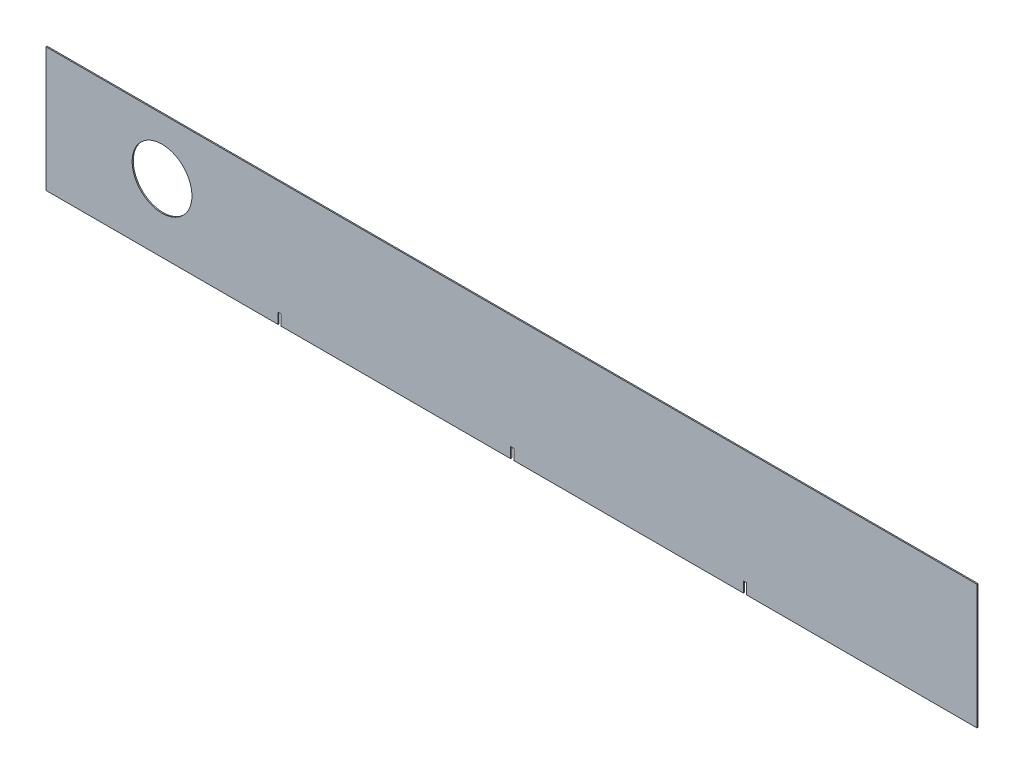
ISO-10303-21;
HEADER;
FILE_DESCRIPTION(('STEP AP214'),'2;1');
FILE_NAME('part.step','',(''),(''),'','','');
FILE_SCHEMA(('AUTOMOTIVE_DESIGN { 1 0 10303 214 1 1 1 1 }'));
ENDSEC;
DATA;
#1=APPLICATION_CONTEXT('core data for automotive mechanical design processes');
#2=APPLICATION_PROTOCOL_DEFINITION('international standard','automotive_design',2000,#1);
#3=PRODUCT_CONTEXT('',#1,'mechanical');
#4=PRODUCT('Part','Part','',(#3));
#5=PRODUCT_RELATED_PRODUCT_CATEGORY('part','',(#4));
#6=PRODUCT_DEFINITION_FORMATION('','',#4);
#7=PRODUCT_DEFINITION_CONTEXT('part definition',#1,'design');
#8=PRODUCT_DEFINITION('design','',#6,#7);
#9=PRODUCT_DEFINITION_SHAPE('','',#8);
#10=(LENGTH_UNIT() NAMED_UNIT(*) SI_UNIT(.MILLI.,.METRE.));
#11=(NAMED_UNIT(*) PLANE_ANGLE_UNIT() SI_UNIT($,.RADIAN.));
#12=(NAMED_UNIT(*) SI_UNIT($,.STERADIAN.) SOLID_ANGLE_UNIT());
#13=UNCERTAINTY_MEASURE_WITH_UNIT(LENGTH_MEASURE(1.E-05),#10,'distance_accuracy_value','');
#14=(GEOMETRIC_REPRESENTATION_CONTEXT(3) GLOBAL_UNCERTAINTY_ASSIGNED_CONTEXT((#13)) GLOBAL_UNIT_ASSIGNED_CONTEXT((#10,
#11,#12)) REPRESENTATION_CONTEXT('',''));
#15=CARTESIAN_POINT('',(0.,0.,0.));
#16=DIRECTION('',(0.,0.,1.));
#17=DIRECTION('',(1.,0.,0.));
#18=AXIS2_PLACEMENT_3D('',#15,#16,#17);
#19=CARTESIAN_POINT('',(0.,0.,0.));
#20=DIRECTION('',(0.,0.,-1.));
#21=DIRECTION('',(-1.,0.,0.));
#22=AXIS2_PLACEMENT_3D('',#19,#20,#21);
#23=PLANE('',#22);
#24=DIRECTION('',(0.,1.,0.));
#25=VECTOR('',#24,1.);
#26=CARTESIAN_POINT('',(1414.9984119364,-97.2312168042145,1.6903145549918E-11));
#27=LINE('',#26,#25);
#28=CARTESIAN_POINT('',(1414.9984119364,103.017676767677,1.69586567011493E-11));
#29=VERTEX_POINT('',#28);
#30=CARTESIAN_POINT('',(1414.9984119364,-115.480110376108,1.67366120962242E-11));
#31=VERTEX_POINT('',#30);
#32=EDGE_CURVE('E293',#29,#31,#27,.F.);
#33=ORIENTED_EDGE('',*,*,#32,.F.);
#34=DIRECTION('',(1.,0.,0.));
#35=VECTOR('',#34,1.);
#36=CARTESIAN_POINT('',(1007.50062479261,103.017676767677,8.49320613838245E-12));
#37=LINE('',#36,#35);
#38=CARTESIAN_POINT('',(-219.494949494949,103.017676767677,0.));
#39=VERTEX_POINT('',#38);
#40=EDGE_CURVE('E124',#39,#29,#37,.T.);
#41=ORIENTED_EDGE('',*,*,#40,.F.);
#42=DIRECTION('',(0.,-1.,0.));
#43=VECTOR('',#42,1.);
#44=CARTESIAN_POINT('',(-219.494949494949,-115.480110376105,-1.52655665885959E-13));
#45=LINE('',#44,#43);
#46=CARTESIAN_POINT('',(-219.494949494949,-115.480110376105,-1.52655665885959E-13));
#47=VERTEX_POINT('',#46);
#48=EDGE_CURVE('E231',#39,#47,#45,.T.);
#49=ORIENTED_EDGE('',*,*,#48,.T.);
#50=DIRECTION('',(1.,0.,0.));
#51=VECTOR('',#50,1.);
#52=CARTESIAN_POINT('',(188.005050505051,-115.480110376105,-1.38777878078145E-13));
#53=LINE('',#52,#51);
#54=CARTESIAN_POINT('',(188.005050505051,-115.480110376105,-1.38777878078145E-13));
#55=VERTEX_POINT('',#54);
#56=EDGE_CURVE('E245',#47,#55,#53,.T.);
#57=ORIENTED_EDGE('',*,*,#56,.T.);
#58=DIRECTION('',(0.,1.,0.));
#59=VECTOR('',#58,1.);
#60=CARTESIAN_POINT('',(188.005050505051,-97.4801103761054,0.));
#61=LINE('',#60,#59);
#62=CARTESIAN_POINT('',(188.005050505051,-96.9823232323232,0.));
#63=VERTEX_POINT('',#62);
#64=EDGE_CURVE('E243',#55,#63,#61,.T.);
#65=ORIENTED_EDGE('',*,*,#64,.T.);
#66=DIRECTION('',(-1.,0.,0.));
#67=VECTOR('',#66,1.);
#68=CARTESIAN_POINT('',(190.753944076942,-96.9823232323232,0.));
#69=LINE('',#68,#67);
#70=CARTESIAN_POINT('',(193.502837648833,-96.9823232323232,0.));
#71=VERTEX_POINT('',#70);
#72=EDGE_CURVE('E232',#71,#63,#69,.T.);
#73=ORIENTED_EDGE('',*,*,#72,.F.);
#74=DIRECTION('',(0.,-1.,0.));
#75=VECTOR('',#74,1.);
#76=CARTESIAN_POINT('',(193.502837648833,-115.480110376107,-8.88178419700125E-13));
#77=LINE('',#76,#75);
#78=CARTESIAN_POINT('',(193.502837648833,-115.480110376107,-8.88178419700125E-13));
#79=VERTEX_POINT('',#78);
#80=EDGE_CURVE('E272',#71,#79,#77,.T.);
#81=ORIENTED_EDGE('',*,*,#80,.T.);
#82=DIRECTION('',(1.,0.,0.));
#83=VECTOR('',#82,1.);
#84=CARTESIAN_POINT('',(596.502837648833,-115.480110376106,2.692290834716E-12));
#85=LINE('',#84,#83);
#86=CARTESIAN_POINT('',(596.502837648833,-115.480110376106,2.692290834716E-12));
#87=VERTEX_POINT('',#86);
#88=EDGE_CURVE('E269',#79,#87,#85,.T.);
#89=ORIENTED_EDGE('',*,*,#88,.T.);
#90=DIRECTION('',(0.,1.,0.));
#91=VECTOR('',#90,1.);
#92=CARTESIAN_POINT('',(596.502837648833,-97.4801103761062,2.80331313717852E-12));
#93=LINE('',#92,#91);
#94=CARTESIAN_POINT('',(596.502837648833,-96.9823232323233,2.80331313717852E-12));
#95=VERTEX_POINT('',#94);
#96=EDGE_CURVE('E267',#87,#95,#93,.T.);
#97=ORIENTED_EDGE('',*,*,#96,.T.);
#98=DIRECTION('',(-1.,0.,0.));
#99=VECTOR('',#98,1.);
#100=CARTESIAN_POINT('',(599.251731220724,-96.9823232323233,2.85882428840978E-12));
#101=LINE('',#100,#99);
#102=CARTESIAN_POINT('',(602.000624792615,-96.9823232323233,2.85882428840978E-12));
#103=VERTEX_POINT('',#102);
#104=EDGE_CURVE('E264',#103,#95,#101,.T.);
#105=ORIENTED_EDGE('',*,*,#104,.F.);
#106=DIRECTION('',(0.,1.,0.));
#107=VECTOR('',#106,1.);
#108=CARTESIAN_POINT('',(602.000624792615,-97.2312168042145,2.85882428840978E-12));
#109=LINE('',#108,#107);
#110=CARTESIAN_POINT('',(602.000624792615,-115.480110376104,5.63438184997267E-12));
#111=VERTEX_POINT('',#110);
#112=EDGE_CURVE('E323',#111,#103,#109,.T.);
#113=ORIENTED_EDGE('',*,*,#112,.F.);
#114=DIRECTION('',(1.,0.,0.));
#115=VECTOR('',#114,1.);
#116=CARTESIAN_POINT('',(1005.00062479261,-115.480110376107,8.38218383591993E-12));
#117=LINE('',#116,#115);
#118=CARTESIAN_POINT('',(1005.00062479261,-115.480110376107,8.38218383591993E-12));
#119=VERTEX_POINT('',#118);
#120=EDGE_CURVE('E314',#111,#119,#117,.T.);
#121=ORIENTED_EDGE('',*,*,#120,.T.);
#122=DIRECTION('',(0.,1.,0.));
#123=VECTOR('',#122,1.);
#124=CARTESIAN_POINT('',(1005.00062479261,-97.2312168042145,8.49320613838245E-12));
#125=LINE('',#124,#123);
#126=CARTESIAN_POINT('',(1005.00062479261,-96.9823232323234,8.49320613838245E-12));
#127=VERTEX_POINT('',#126);
#128=EDGE_CURVE('E111',#127,#119,#125,.F.);
#129=ORIENTED_EDGE('',*,*,#128,.F.);
#130=DIRECTION('',(-1.,0.,0.));
#131=VECTOR('',#130,1.);
#132=CARTESIAN_POINT('',(1007.74951836451,-96.9823232323234,8.54871728961371E-12));
#133=LINE('',#132,#131);
#134=CARTESIAN_POINT('',(1010.4984119364,-96.9823232323235,8.43769498715119E-12));
#135=VERTEX_POINT('',#134);
#136=EDGE_CURVE('E87',#135,#127,#133,.T.);
#137=ORIENTED_EDGE('',*,*,#136,.F.);
#138=DIRECTION('',(0.,-1.,0.));
#139=VECTOR('',#138,1.);
#140=CARTESIAN_POINT('',(1010.4984119364,-115.480110376108,8.04911692853238E-12));
#141=LINE('',#140,#139);
#142=CARTESIAN_POINT('',(1010.4984119364,-115.480110376108,8.04911692853238E-12));
#143=VERTEX_POINT('',#142);
#144=EDGE_CURVE('E291',#135,#143,#141,.T.);
#145=ORIENTED_EDGE('',*,*,#144,.T.);
#146=DIRECTION('',(1.,0.,0.));
#147=VECTOR('',#146,1.);
#148=CARTESIAN_POINT('',(1414.9984119364,-115.480110376108,1.67366120962242E-11));
#149=LINE('',#148,#147);
#150=EDGE_CURVE('E288',#143,#31,#149,.T.);
#151=ORIENTED_EDGE('',*,*,#150,.T.);
#152=EDGE_LOOP('',(#33,#41,#49,#57,#65,#73,#81,#89,#97,#105,#113,#121,#129,#137,#145,#151));
#153=FACE_BOUND('',#152,.T.);
#154=CARTESIAN_POINT('',(-15.7449494949495,4.26767676767675,0.));
#155=DIRECTION('',(0.,0.,1.));
#156=DIRECTION('',(1.,0.,0.));
#157=AXIS2_PLACEMENT_3D('',#154,#155,#156);
#158=CIRCLE('',#157,52.5);
#159=CARTESIAN_POINT('',(36.7550505050505,4.26767676767675,0.));
#160=VERTEX_POINT('',#159);
#161=EDGE_CURVE('E249',#160,#160,#158,.T.);
#162=ORIENTED_EDGE('',*,*,#161,.F.);
#163=EDGE_LOOP('',(#162));
#164=FACE_BOUND('',#163,.T.);
#165=ADVANCED_FACE('F73',(#153,#164),#23,.F.);
#166=CARTESIAN_POINT('',(790.005675297664,0.,-1.99999999999453));
#167=DIRECTION('',(0.,0.,1.));
#168=DIRECTION('',(1.,0.,0.));
#169=AXIS2_PLACEMENT_3D('',#166,#167,#168);
#170=PLANE('',#169);
#171=DIRECTION('',(-1.,0.,0.));
#172=VECTOR('',#171,1.);
#173=CARTESIAN_POINT('',(1007.74951836451,-96.9823232323234,-1.99999999999145));
#174=LINE('',#173,#172);
#175=CARTESIAN_POINT('',(1010.4984119364,-96.9823232323235,-1.99999999999151));
#176=VERTEX_POINT('',#175);
#177=CARTESIAN_POINT('',(1005.00062479261,-96.9823232323234,-1.99999999999145));
#178=VERTEX_POINT('',#177);
#179=EDGE_CURVE('E308',#176,#178,#174,.T.);
#180=ORIENTED_EDGE('',*,*,#179,.T.);
#181=DIRECTION('',(0.,1.,0.));
#182=VECTOR('',#181,1.);
#183=CARTESIAN_POINT('',(1005.00062479261,-97.2312168042145,-1.99999999999151));
#184=LINE('',#183,#182);
#185=CARTESIAN_POINT('',(1005.00062479261,-115.480110376107,-1.99999999999162));
#186=VERTEX_POINT('',#185);
#187=EDGE_CURVE('E321',#178,#186,#184,.F.);
#188=ORIENTED_EDGE('',*,*,#187,.T.);
#189=DIRECTION('',(1.,0.,0.));
#190=VECTOR('',#189,1.);
#191=CARTESIAN_POINT('',(1005.00062479261,-115.480110376107,-1.99999999999162));
#192=LINE('',#191,#190);
#193=CARTESIAN_POINT('',(602.000624792615,-115.480110376104,-1.99999999999437));
#194=VERTEX_POINT('',#193);
#195=EDGE_CURVE('E310',#194,#186,#192,.T.);
#196=ORIENTED_EDGE('',*,*,#195,.F.);
#197=DIRECTION('',(0.,1.,0.));
#198=VECTOR('',#197,1.);
#199=CARTESIAN_POINT('',(602.000624792615,-97.2312168042145,-1.99999999999714));
#200=LINE('',#199,#198);
#201=CARTESIAN_POINT('',(602.000624792615,-96.9823232323233,-1.99999999999714));
#202=VERTEX_POINT('',#201);
#203=EDGE_CURVE('E96',#194,#202,#200,.T.);
#204=ORIENTED_EDGE('',*,*,#203,.T.);
#205=DIRECTION('',(-1.,0.,0.));
#206=VECTOR('',#205,1.);
#207=CARTESIAN_POINT('',(599.251731220724,-96.9823232323233,-1.99999999999714));
#208=LINE('',#207,#206);
#209=CARTESIAN_POINT('',(596.502837648833,-96.9823232323233,-1.99999999999717));
#210=VERTEX_POINT('',#209);
#211=EDGE_CURVE('E159',#202,#210,#208,.T.);
#212=ORIENTED_EDGE('',*,*,#211,.T.);
#213=DIRECTION('',(0.,1.,0.));
#214=VECTOR('',#213,1.);
#215=CARTESIAN_POINT('',(596.502837648833,-97.4801103761062,-1.9999999999972));
#216=LINE('',#215,#214);
#217=CARTESIAN_POINT('',(596.502837648833,-115.480110376106,-1.99999999999731));
#218=VERTEX_POINT('',#217);
#219=EDGE_CURVE('E265',#218,#210,#216,.T.);
#220=ORIENTED_EDGE('',*,*,#219,.F.);
#221=DIRECTION('',(1.,0.,0.));
#222=VECTOR('',#221,1.);
#223=CARTESIAN_POINT('',(596.502837648833,-115.480110376106,-1.99999999999731));
#224=LINE('',#223,#222);
#225=CARTESIAN_POINT('',(193.502837648833,-115.480110376107,-2.00000000000089));
#226=VERTEX_POINT('',#225);
#227=EDGE_CURVE('E259',#226,#218,#224,.T.);
#228=ORIENTED_EDGE('',*,*,#227,.F.);
#229=DIRECTION('',(0.,-1.,0.));
#230=VECTOR('',#229,1.);
#231=CARTESIAN_POINT('',(193.502837648833,-115.480110376107,-2.00000000000089));
#232=LINE('',#231,#230);
#233=CARTESIAN_POINT('',(193.502837648833,-96.9823232323232,-2.00000000000004));
#234=VERTEX_POINT('',#233);
#235=EDGE_CURVE('E277',#234,#226,#232,.T.);
#236=ORIENTED_EDGE('',*,*,#235,.F.);
#237=DIRECTION('',(-1.,0.,0.));
#238=VECTOR('',#237,1.);
#239=CARTESIAN_POINT('',(190.753944076942,-96.9823232323232,-2.00000000000004));
#240=LINE('',#239,#238);
#241=CARTESIAN_POINT('',(188.005050505051,-96.9823232323232,-2.00000000000004));
#242=VERTEX_POINT('',#241);
#243=EDGE_CURVE('E236',#234,#242,#240,.T.);
#244=ORIENTED_EDGE('',*,*,#243,.T.);
#245=DIRECTION('',(0.,1.,0.));
#246=VECTOR('',#245,1.);
#247=CARTESIAN_POINT('',(188.005050505051,-97.4801103761054,-2.00000000000002));
#248=LINE('',#247,#246);
#249=CARTESIAN_POINT('',(188.005050505051,-115.480110376105,-2.00000000000014));
#250=VERTEX_POINT('',#249);
#251=EDGE_CURVE('E239',#250,#242,#248,.T.);
#252=ORIENTED_EDGE('',*,*,#251,.F.);
#253=DIRECTION('',(1.,0.,0.));
#254=VECTOR('',#253,1.);
#255=CARTESIAN_POINT('',(188.005050505051,-115.480110376105,-2.00000000000014));
#256=LINE('',#255,#254);
#257=CARTESIAN_POINT('',(-219.494949494949,-115.480110376105,-2.00000000000015));
#258=VERTEX_POINT('',#257);
#259=EDGE_CURVE('E222',#258,#250,#256,.T.);
#260=ORIENTED_EDGE('',*,*,#259,.F.);
#261=DIRECTION('',(0.,-1.,0.));
#262=VECTOR('',#261,1.);
#263=CARTESIAN_POINT('',(-219.494949494949,-115.480110376105,-2.00000000000015));
#264=LINE('',#263,#262);
#265=CARTESIAN_POINT('',(-219.494949494949,103.017676767677,-2.));
#266=VERTEX_POINT('',#265);
#267=EDGE_CURVE('E217',#266,#258,#264,.T.);
#268=ORIENTED_EDGE('',*,*,#267,.F.);
#269=DIRECTION('',(1.,0.,0.));
#270=VECTOR('',#269,1.);
#271=CARTESIAN_POINT('',(1007.50062479261,103.017676767677,-1.99999999999151));
#272=LINE('',#271,#270);
#273=CARTESIAN_POINT('',(1414.9984119364,103.017676767677,-1.99999999998304));
#274=VERTEX_POINT('',#273);
#275=EDGE_CURVE('E207',#266,#274,#272,.T.);
#276=ORIENTED_EDGE('',*,*,#275,.T.);
#277=DIRECTION('',(0.,1.,0.));
#278=VECTOR('',#277,1.);
#279=CARTESIAN_POINT('',(1414.9984119364,-97.4801103761077,-1.9999999999831));
#280=LINE('',#279,#278);
#281=CARTESIAN_POINT('',(1414.9984119364,-115.480110376108,-1.99999999998327));
#282=VERTEX_POINT('',#281);
#283=EDGE_CURVE('E305',#282,#274,#280,.T.);
#284=ORIENTED_EDGE('',*,*,#283,.F.);
#285=DIRECTION('',(1.,0.,0.));
#286=VECTOR('',#285,1.);
#287=CARTESIAN_POINT('',(1414.9984119364,-115.480110376108,-1.99999999998327));
#288=LINE('',#287,#286);
#289=CARTESIAN_POINT('',(1010.4984119364,-115.480110376108,-1.99999999999195));
#290=VERTEX_POINT('',#289);
#291=EDGE_CURVE('E302',#290,#282,#288,.T.);
#292=ORIENTED_EDGE('',*,*,#291,.F.);
#293=DIRECTION('',(0.,-1.,0.));
#294=VECTOR('',#293,1.);
#295=CARTESIAN_POINT('',(1010.4984119364,-115.480110376108,-1.99999999999195));
#296=LINE('',#295,#294);
#297=EDGE_CURVE('E151',#176,#290,#296,.T.);
#298=ORIENTED_EDGE('',*,*,#297,.F.);
#299=EDGE_LOOP('',(#180,#188,#196,#204,#212,#220,#228,#236,#244,#252,#260,#268,#276,#284,#292,#298));
#300=FACE_BOUND('',#299,.T.);
#301=CARTESIAN_POINT('',(-15.7449494949495,4.26767676767675,-2.));
#302=DIRECTION('',(0.,0.,-1.));
#303=DIRECTION('',(-1.,0.,0.));
#304=AXIS2_PLACEMENT_3D('',#301,#302,#303);
#305=CIRCLE('',#304,52.5);
#306=CARTESIAN_POINT('',(-68.2449494949494,4.26767676767675,-2.));
#307=VERTEX_POINT('',#306);
#308=EDGE_CURVE('E252',#307,#307,#305,.T.);
#309=ORIENTED_EDGE('',*,*,#308,.F.);
#310=EDGE_LOOP('',(#309));
#311=FACE_BOUND('',#310,.T.);
#312=ADVANCED_FACE('F218',(#300,#311),#170,.F.);
#313=CARTESIAN_POINT('',(1007.50062479261,103.017676767677,8.49320613838245E-12));
#314=DIRECTION('',(0.,1.,0.));
#315=DIRECTION('',(1.,0.,0.));
#316=AXIS2_PLACEMENT_3D('',#313,#314,#315);
#317=PLANE('',#316);
#318=ORIENTED_EDGE('',*,*,#40,.T.);
#319=DIRECTION('',(0.,0.,-1.));
#320=VECTOR('',#319,1.);
#321=CARTESIAN_POINT('',(1414.9984119364,103.017676767677,1.69586567011493E-11));
#322=LINE('',#321,#320);
#323=EDGE_CURVE('E213',#29,#274,#322,.T.);
#324=ORIENTED_EDGE('',*,*,#323,.T.);
#325=ORIENTED_EDGE('',*,*,#275,.F.);
#326=DIRECTION('',(0.,0.,1.));
#327=VECTOR('',#326,1.);
#328=CARTESIAN_POINT('',(-219.494949494949,103.017676767677,-2.));
#329=LINE('',#328,#327);
#330=EDGE_CURVE('E211',#266,#39,#329,.T.);
#331=ORIENTED_EDGE('',*,*,#330,.T.);
#332=EDGE_LOOP('',(#318,#324,#325,#331));
#333=FACE_BOUND('',#332,.T.);
#334=ADVANCED_FACE('F209',(#333),#317,.T.);
#335=CARTESIAN_POINT('',(602.000624792615,-97.2312168042145,-0.999999999997142));
#336=DIRECTION('',(-1.,0.,0.));
#337=DIRECTION('',(0.,1.,0.));
#338=AXIS2_PLACEMENT_3D('',#335,#336,#337);
#339=PLANE('',#338);
#340=DIRECTION('',(0.,0.,1.));
#341=VECTOR('',#340,1.);
#342=CARTESIAN_POINT('',(602.000624792615,-96.9823232323233,-1.99999999999725));
#343=LINE('',#342,#341);
#344=EDGE_CURVE('E80',#202,#103,#343,.T.);
#345=ORIENTED_EDGE('',*,*,#344,.F.);
#346=ORIENTED_EDGE('',*,*,#203,.F.);
#347=DIRECTION('',(0.,0.,1.));
#348=VECTOR('',#347,1.);
#349=CARTESIAN_POINT('',(602.000624792615,-115.480110376104,-1.99999999999437));
#350=LINE('',#349,#348);
#351=EDGE_CURVE('E312',#194,#111,#350,.T.);
#352=ORIENTED_EDGE('',*,*,#351,.T.);
#353=ORIENTED_EDGE('',*,*,#112,.T.);
#354=EDGE_LOOP('',(#345,#346,#352,#353));
#355=FACE_BOUND('',#354,.T.);
#356=ADVANCED_FACE('F334',(#355),#339,.T.);
#357=CARTESIAN_POINT('',(1005.00062479261,-97.2312168042145,-0.999999999991508));
#358=DIRECTION('',(-1.,0.,0.));
#359=DIRECTION('',(0.,1.,0.));
#360=AXIS2_PLACEMENT_3D('',#357,#358,#359);
#361=PLANE('',#360);
#362=ORIENTED_EDGE('',*,*,#187,.F.);
#363=DIRECTION('',(0.,0.,1.));
#364=VECTOR('',#363,1.);
#365=CARTESIAN_POINT('',(1005.00062479261,-96.9823232323234,-1.99999999999145));
#366=LINE('',#365,#364);
#367=EDGE_CURVE('E115',#178,#127,#366,.T.);
#368=ORIENTED_EDGE('',*,*,#367,.T.);
#369=ORIENTED_EDGE('',*,*,#128,.T.);
#370=DIRECTION('',(0.,0.,1.));
#371=VECTOR('',#370,1.);
#372=CARTESIAN_POINT('',(1005.00062479261,-115.480110376107,-1.99999999999162));
#373=LINE('',#372,#371);
#374=EDGE_CURVE('E317',#186,#119,#373,.T.);
#375=ORIENTED_EDGE('',*,*,#374,.F.);
#376=EDGE_LOOP('',(#362,#368,#369,#375));
#377=FACE_BOUND('',#376,.T.);
#378=ADVANCED_FACE('F340',(#377),#361,.F.);
#379=CARTESIAN_POINT('',(1005.00062479261,-115.480110376107,-1.99999999999162));
#380=DIRECTION('',(0.,-1.,0.));
#381=DIRECTION('',(1.,0.,0.));
#382=AXIS2_PLACEMENT_3D('',#379,#380,#381);
#383=PLANE('',#382);
#384=ORIENTED_EDGE('',*,*,#120,.F.);
#385=ORIENTED_EDGE('',*,*,#351,.F.);
#386=ORIENTED_EDGE('',*,*,#195,.T.);
#387=ORIENTED_EDGE('',*,*,#374,.T.);
#388=EDGE_LOOP('',(#384,#385,#386,#387));
#389=FACE_BOUND('',#388,.T.);
#390=ADVANCED_FACE('F338',(#389),#383,.T.);
#391=CARTESIAN_POINT('',(1007.74951836451,-96.9823232323234,-0.999999999991452));
#392=DIRECTION('',(0.,-1.,0.));
#393=DIRECTION('',(-1.,0.,0.));
#394=AXIS2_PLACEMENT_3D('',#391,#392,#393);
#395=PLANE('',#394);
#396=ORIENTED_EDGE('',*,*,#136,.T.);
#397=ORIENTED_EDGE('',*,*,#367,.F.);
#398=ORIENTED_EDGE('',*,*,#179,.F.);
#399=DIRECTION('',(0.,0.,1.));
#400=VECTOR('',#399,1.);
#401=CARTESIAN_POINT('',(1010.4984119364,-96.9823232323235,-1.99999999999162));
#402=LINE('',#401,#400);
#403=EDGE_CURVE('E284',#176,#135,#402,.T.);
#404=ORIENTED_EDGE('',*,*,#403,.T.);
#405=EDGE_LOOP('',(#396,#397,#398,#404));
#406=FACE_BOUND('',#405,.T.);
#407=ADVANCED_FACE('F341',(#406),#395,.T.);
#408=CARTESIAN_POINT('',(1414.9984119364,-97.4801103761077,-1.9999999999831));
#409=DIRECTION('',(1.,0.,0.));
#410=DIRECTION('',(0.,1.,0.));
#411=AXIS2_PLACEMENT_3D('',#408,#409,#410);
#412=PLANE('',#411);
#413=ORIENTED_EDGE('',*,*,#283,.T.);
#414=ORIENTED_EDGE('',*,*,#323,.F.);
#415=ORIENTED_EDGE('',*,*,#32,.T.);
#416=DIRECTION('',(0.,0.,1.));
#417=VECTOR('',#416,1.);
#418=CARTESIAN_POINT('',(1414.9984119364,-115.480110376108,-1.99999999998327));
#419=LINE('',#418,#417);
#420=EDGE_CURVE('E299',#282,#31,#419,.T.);
#421=ORIENTED_EDGE('',*,*,#420,.F.);
#422=EDGE_LOOP('',(#413,#414,#415,#421));
#423=FACE_BOUND('',#422,.T.);
#424=ADVANCED_FACE('F349',(#423),#412,.T.);
#425=CARTESIAN_POINT('',(1414.9984119364,-115.480110376108,-1.99999999998327));
#426=DIRECTION('',(0.,-1.,0.));
#427=DIRECTION('',(1.,0.,0.));
#428=AXIS2_PLACEMENT_3D('',#425,#426,#427);
#429=PLANE('',#428);
#430=ORIENTED_EDGE('',*,*,#150,.F.);
#431=DIRECTION('',(0.,0.,1.));
#432=VECTOR('',#431,1.);
#433=CARTESIAN_POINT('',(1010.4984119364,-115.480110376108,-1.99999999999195));
#434=LINE('',#433,#432);
#435=EDGE_CURVE('E295',#290,#143,#434,.T.);
#436=ORIENTED_EDGE('',*,*,#435,.F.);
#437=ORIENTED_EDGE('',*,*,#291,.T.);
#438=ORIENTED_EDGE('',*,*,#420,.T.);
#439=EDGE_LOOP('',(#430,#436,#437,#438));
#440=FACE_BOUND('',#439,.T.);
#441=ADVANCED_FACE('F347',(#440),#429,.T.);
#442=CARTESIAN_POINT('',(1010.4984119364,-115.480110376108,-1.99999999999195));
#443=DIRECTION('',(-1.,0.,0.));
#444=DIRECTION('',(0.,-1.,0.));
#445=AXIS2_PLACEMENT_3D('',#442,#443,#444);
#446=PLANE('',#445);
#447=ORIENTED_EDGE('',*,*,#144,.F.);
#448=ORIENTED_EDGE('',*,*,#403,.F.);
#449=ORIENTED_EDGE('',*,*,#297,.T.);
#450=ORIENTED_EDGE('',*,*,#435,.T.);
#451=EDGE_LOOP('',(#447,#448,#449,#450));
#452=FACE_BOUND('',#451,.T.);
#453=ADVANCED_FACE('F343',(#452),#446,.T.);
#454=CARTESIAN_POINT('',(599.251731220724,-96.9823232323233,-0.999999999997142));
#455=DIRECTION('',(0.,-1.,0.));
#456=DIRECTION('',(-1.,0.,0.));
#457=AXIS2_PLACEMENT_3D('',#454,#455,#456);
#458=PLANE('',#457);
#459=ORIENTED_EDGE('',*,*,#104,.T.);
#460=DIRECTION('',(0.,0.,1.));
#461=VECTOR('',#460,1.);
#462=CARTESIAN_POINT('',(596.502837648833,-96.9823232323233,-1.9999999999972));
#463=LINE('',#462,#461);
#464=EDGE_CURVE('E261',#210,#95,#463,.T.);
#465=ORIENTED_EDGE('',*,*,#464,.F.);
#466=ORIENTED_EDGE('',*,*,#211,.F.);
#467=ORIENTED_EDGE('',*,*,#344,.T.);
#468=EDGE_LOOP('',(#459,#465,#466,#467));
#469=FACE_BOUND('',#468,.T.);
#470=ADVANCED_FACE('F330',(#469),#458,.T.);
#471=CARTESIAN_POINT('',(596.502837648833,-115.480110376106,-1.99999999999731));
#472=DIRECTION('',(0.,-1.,0.));
#473=DIRECTION('',(1.,0.,0.));
#474=AXIS2_PLACEMENT_3D('',#471,#472,#473);
#475=PLANE('',#474);
#476=ORIENTED_EDGE('',*,*,#88,.F.);
#477=DIRECTION('',(0.,0.,1.));
#478=VECTOR('',#477,1.);
#479=CARTESIAN_POINT('',(193.502837648833,-115.480110376107,-2.00000000000089));
#480=LINE('',#479,#478);
#481=EDGE_CURVE('E274',#226,#79,#480,.T.);
#482=ORIENTED_EDGE('',*,*,#481,.F.);
#483=ORIENTED_EDGE('',*,*,#227,.T.);
#484=DIRECTION('',(0.,0.,1.));
#485=VECTOR('',#484,1.);
#486=CARTESIAN_POINT('',(596.502837648833,-115.480110376106,-1.99999999999731));
#487=LINE('',#486,#485);
#488=EDGE_CURVE('E279',#218,#87,#487,.T.);
#489=ORIENTED_EDGE('',*,*,#488,.T.);
#490=EDGE_LOOP('',(#476,#482,#483,#489));
#491=FACE_BOUND('',#490,.T.);
#492=ADVANCED_FACE('F378',(#491),#475,.T.);
#493=CARTESIAN_POINT('',(193.502837648833,-115.480110376107,-2.00000000000089));
#494=DIRECTION('',(-1.,0.,0.));
#495=DIRECTION('',(0.,-1.,0.));
#496=AXIS2_PLACEMENT_3D('',#493,#494,#495);
#497=PLANE('',#496);
#498=ORIENTED_EDGE('',*,*,#80,.F.);
#499=DIRECTION('',(0.,0.,1.));
#500=VECTOR('',#499,1.);
#501=CARTESIAN_POINT('',(193.502837648833,-96.9823232323232,-1.99999999999997));
#502=LINE('',#501,#500);
#503=EDGE_CURVE('E12',#234,#71,#502,.T.);
#504=ORIENTED_EDGE('',*,*,#503,.F.);
#505=ORIENTED_EDGE('',*,*,#235,.T.);
#506=ORIENTED_EDGE('',*,*,#481,.T.);
#507=EDGE_LOOP('',(#498,#504,#505,#506));
#508=FACE_BOUND('',#507,.T.);
#509=ADVANCED_FACE('F382',(#508),#497,.T.);
#510=CARTESIAN_POINT('',(596.502837648833,-97.4801103761062,-1.9999999999972));
#511=DIRECTION('',(1.,0.,0.));
#512=DIRECTION('',(0.,1.,0.));
#513=AXIS2_PLACEMENT_3D('',#510,#511,#512);
#514=PLANE('',#513);
#515=ORIENTED_EDGE('',*,*,#219,.T.);
#516=ORIENTED_EDGE('',*,*,#464,.T.);
#517=ORIENTED_EDGE('',*,*,#96,.F.);
#518=ORIENTED_EDGE('',*,*,#488,.F.);
#519=EDGE_LOOP('',(#515,#516,#517,#518));
#520=FACE_BOUND('',#519,.T.);
#521=ADVANCED_FACE('F386',(#520),#514,.T.);
#522=CARTESIAN_POINT('',(190.753944076942,-96.9823232323232,-1.00000000000004));
#523=DIRECTION('',(0.,-1.,0.));
#524=DIRECTION('',(-1.,0.,0.));
#525=AXIS2_PLACEMENT_3D('',#522,#523,#524);
#526=PLANE('',#525);
#527=ORIENTED_EDGE('',*,*,#72,.T.);
#528=DIRECTION('',(0.,0.,1.));
#529=VECTOR('',#528,1.);
#530=CARTESIAN_POINT('',(188.005050505051,-96.9823232323232,-2.00000000000004));
#531=LINE('',#530,#529);
#532=EDGE_CURVE('E233',#242,#63,#531,.T.);
#533=ORIENTED_EDGE('',*,*,#532,.F.);
#534=ORIENTED_EDGE('',*,*,#243,.F.);
#535=ORIENTED_EDGE('',*,*,#503,.T.);
#536=EDGE_LOOP('',(#527,#533,#534,#535));
#537=FACE_BOUND('',#536,.T.);
#538=ADVANCED_FACE('F389',(#537),#526,.T.);
#539=CARTESIAN_POINT('',(188.005050505051,-115.480110376105,-2.00000000000014));
#540=DIRECTION('',(0.,-1.,0.));
#541=DIRECTION('',(0.,0.,-1.));
#542=AXIS2_PLACEMENT_3D('',#539,#540,#541);
#543=PLANE('',#542);
#544=ORIENTED_EDGE('',*,*,#56,.F.);
#545=DIRECTION('',(0.,0.,1.));
#546=VECTOR('',#545,1.);
#547=CARTESIAN_POINT('',(-219.494949494949,-115.480110376105,-2.00000000000015));
#548=LINE('',#547,#546);
#549=EDGE_CURVE('E226',#258,#47,#548,.T.);
#550=ORIENTED_EDGE('',*,*,#549,.F.);
#551=ORIENTED_EDGE('',*,*,#259,.T.);
#552=DIRECTION('',(0.,0.,1.));
#553=VECTOR('',#552,1.);
#554=CARTESIAN_POINT('',(188.005050505051,-115.480110376105,-2.00000000000014));
#555=LINE('',#554,#553);
#556=EDGE_CURVE('E227',#250,#55,#555,.T.);
#557=ORIENTED_EDGE('',*,*,#556,.T.);
#558=EDGE_LOOP('',(#544,#550,#551,#557));
#559=FACE_BOUND('',#558,.T.);
#560=ADVANCED_FACE('F396',(#559),#543,.T.);
#561=CARTESIAN_POINT('',(-219.494949494949,-115.480110376105,-2.00000000000015));
#562=DIRECTION('',(-1.,0.,0.));
#563=DIRECTION('',(0.,0.,-1.));
#564=AXIS2_PLACEMENT_3D('',#561,#562,#563);
#565=PLANE('',#564);
#566=ORIENTED_EDGE('',*,*,#48,.F.);
#567=ORIENTED_EDGE('',*,*,#330,.F.);
#568=ORIENTED_EDGE('',*,*,#267,.T.);
#569=ORIENTED_EDGE('',*,*,#549,.T.);
#570=EDGE_LOOP('',(#566,#567,#568,#569));
#571=FACE_BOUND('',#570,.T.);
#572=ADVANCED_FACE('F230',(#571),#565,.T.);
#573=CARTESIAN_POINT('',(-15.7449494949495,4.26767676767675,-10.));
#574=DIRECTION('',(0.,0.,1.));
#575=DIRECTION('',(1.,0.,0.));
#576=AXIS2_PLACEMENT_3D('',#573,#574,#575);
#577=CYLINDRICAL_SURFACE('',#576,52.5);
#578=ORIENTED_EDGE('',*,*,#308,.T.);
#579=EDGE_LOOP('',(#578));
#580=FACE_BOUND('',#579,.T.);
#581=ORIENTED_EDGE('',*,*,#161,.T.);
#582=EDGE_LOOP('',(#581));
#583=FACE_BOUND('',#582,.T.);
#584=ADVANCED_FACE('F401',(#580,#583),#577,.F.);
#585=CARTESIAN_POINT('',(188.005050505051,-97.4801103761054,-2.00000000000002));
#586=DIRECTION('',(1.,0.,0.));
#587=DIRECTION('',(0.,1.,0.));
#588=AXIS2_PLACEMENT_3D('',#585,#586,#587);
#589=PLANE('',#588);
#590=ORIENTED_EDGE('',*,*,#251,.T.);
#591=ORIENTED_EDGE('',*,*,#532,.T.);
#592=ORIENTED_EDGE('',*,*,#64,.F.);
#593=ORIENTED_EDGE('',*,*,#556,.F.);
#594=EDGE_LOOP('',(#590,#591,#592,#593));
#595=FACE_BOUND('',#594,.T.);
#596=ADVANCED_FACE('F398',(#595),#589,.T.);
#597=CLOSED_SHELL('',(#165,#312,#334,#356,#378,#390,#407,#424,#441,#453,#470,#492,#509,#521,
#538,#560,#572,#584,#596));
#598=MANIFOLD_SOLID_BREP('B2',#597);
#599=ADVANCED_BREP_SHAPE_REPRESENTATION('',(#18,#598),#14);
#600=SHAPE_DEFINITION_REPRESENTATION(#9,#599);
ENDSEC;
END-ISO-10303-21;
